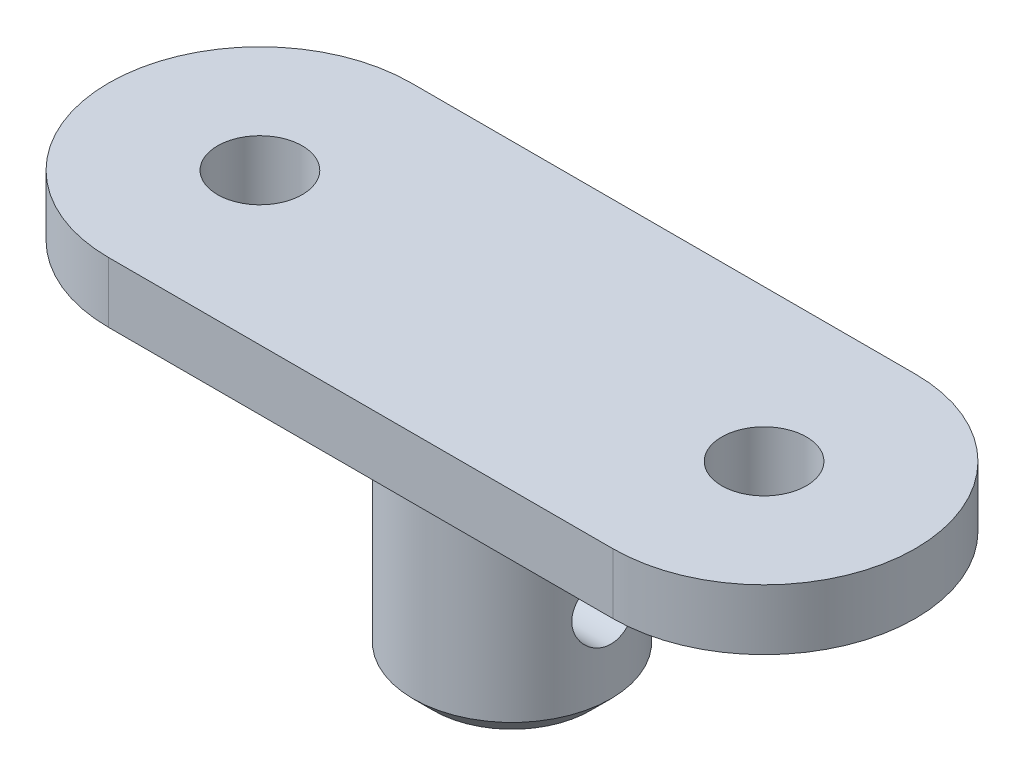
ISO-10303-21;
HEADER;
FILE_DESCRIPTION(('STEP AP214'),'2;1');
FILE_NAME('part.step','',(''),(''),'','','');
FILE_SCHEMA(('AUTOMOTIVE_DESIGN { 1 0 10303 214 1 1 1 1 }'));
ENDSEC;
DATA;
#1=APPLICATION_CONTEXT('core data for automotive mechanical design processes');
#2=APPLICATION_PROTOCOL_DEFINITION('international standard','automotive_design',2000,#1);
#3=PRODUCT_CONTEXT('',#1,'mechanical');
#4=PRODUCT('Part','Part','',(#3));
#5=PRODUCT_RELATED_PRODUCT_CATEGORY('part','',(#4));
#6=PRODUCT_DEFINITION_FORMATION('','',#4);
#7=PRODUCT_DEFINITION_CONTEXT('part definition',#1,'design');
#8=PRODUCT_DEFINITION('design','',#6,#7);
#9=PRODUCT_DEFINITION_SHAPE('','',#8);
#10=(LENGTH_UNIT() NAMED_UNIT(*) SI_UNIT(.MILLI.,.METRE.));
#11=(NAMED_UNIT(*) PLANE_ANGLE_UNIT() SI_UNIT($,.RADIAN.));
#12=(NAMED_UNIT(*) SI_UNIT($,.STERADIAN.) SOLID_ANGLE_UNIT());
#13=UNCERTAINTY_MEASURE_WITH_UNIT(LENGTH_MEASURE(1.E-05),#10,'distance_accuracy_value','');
#14=(GEOMETRIC_REPRESENTATION_CONTEXT(3) GLOBAL_UNCERTAINTY_ASSIGNED_CONTEXT((#13)) GLOBAL_UNIT_ASSIGNED_CONTEXT((#10,
#11,#12)) REPRESENTATION_CONTEXT('',''));
#15=CARTESIAN_POINT('',(0.,0.,0.));
#16=DIRECTION('',(0.,0.,1.));
#17=DIRECTION('',(1.,0.,0.));
#18=AXIS2_PLACEMENT_3D('',#15,#16,#17);
#19=CARTESIAN_POINT('',(0.,15.,0.));
#20=DIRECTION('',(0.,-1.,0.));
#21=DIRECTION('',(0.,0.,-1.));
#22=AXIS2_PLACEMENT_3D('',#19,#20,#21);
#23=CYLINDRICAL_SURFACE('',#22,4.9);
#24=CARTESIAN_POINT('',(4.61383788185064,5.,-1.65));
#25=CARTESIAN_POINT('',(4.61383741638784,4.91018622223396,-1.65000061826013));
#26=CARTESIAN_POINT('',(4.61648902868653,4.82037649379896,-1.64264203896412));
#27=CARTESIAN_POINT('',(4.62675242808979,4.64342146354669,-1.61350405268786));
#28=CARTESIAN_POINT('',(4.63436494825937,4.55627655749849,-1.5917225144436));
#29=CARTESIAN_POINT('',(4.65359224203534,4.38724403113662,-1.53459341170567));
#30=CARTESIAN_POINT('',(4.66519903629909,4.30534631254454,-1.49927287810168));
#31=CARTESIAN_POINT('',(4.69109538211934,4.14861188739389,-1.41616100976829));
#32=CARTESIAN_POINT('',(4.70538554416184,4.07377679346765,-1.36836683622701));
#33=CARTESIAN_POINT('',(4.73567849827398,3.93030312041319,-1.2596197021252));
#34=CARTESIAN_POINT('',(4.75172460314816,3.86198764267123,-1.19825242353303));
#35=CARTESIAN_POINT('',(4.78335572567372,3.73639688446341,-1.06498488639191));
#36=CARTESIAN_POINT('',(4.7989406672018,3.67912341816897,-0.993082900429704));
#37=CARTESIAN_POINT('',(4.82839597766151,3.57576949916901,-0.838417273941764));
#38=CARTESIAN_POINT('',(4.84220948634913,3.53002856624415,-0.755414965953101));
#39=CARTESIAN_POINT('',(4.86605439187122,3.45328657732961,-0.582349019455718));
#40=CARTESIAN_POINT('',(4.87608683011627,3.42228146207618,-0.492287333560855));
#41=CARTESIAN_POINT('',(4.89093236595755,3.37698979687593,-0.311047525716084));
#42=CARTESIAN_POINT('',(4.89591788182399,3.36214953659557,-0.220022162893077));
#43=CARTESIAN_POINT('',(4.90072039525904,3.34784719135327,-0.0366458571353608));
#44=CARTESIAN_POINT('',(4.90053875171023,3.3483810632341,0.0557047309003419));
#45=CARTESIAN_POINT('',(4.89514369864829,3.36446284238568,0.23518692874002));
#46=CARTESIAN_POINT('',(4.89013192574893,3.37940910923578,0.322379504325789));
#47=CARTESIAN_POINT('',(4.87589377741665,3.42289515261397,0.4929375913578));
#48=CARTESIAN_POINT('',(4.86666711487606,3.45143585516639,0.576302841670504));
#49=CARTESIAN_POINT('',(4.84478142949621,3.52164608937421,0.738143239333841));
#50=CARTESIAN_POINT('',(4.83207845069587,3.56348494398242,0.816538740799304));
#51=CARTESIAN_POINT('',(4.80455956847528,3.65896356057803,0.965372506411448));
#52=CARTESIAN_POINT('',(4.78974306954631,3.71260665086469,1.03580851782116));
#53=CARTESIAN_POINT('',(4.75871720972646,3.83319274113201,1.17030053479087));
#54=CARTESIAN_POINT('',(4.74247512826441,3.9006504289464,1.23388819953431));
#55=CARTESIAN_POINT('',(4.71102573247564,4.04540738067902,1.34900194117804));
#56=CARTESIAN_POINT('',(4.69581858478183,4.12270822370127,1.40052607899436));
#57=CARTESIAN_POINT('',(4.66797956974422,4.28646906803758,1.49071671197138));
#58=CARTESIAN_POINT('',(4.65538918352226,4.37304777465974,1.52918145703781));
#59=CARTESIAN_POINT('',(4.63468916349996,4.55198446849131,1.59082564701159));
#60=CARTESIAN_POINT('',(4.62657760576628,4.64433995520701,1.61401165590863));
#61=CARTESIAN_POINT('',(4.61619043349539,4.82766423609059,1.64347807659181));
#62=CARTESIAN_POINT('',(4.61366387213311,4.91850187189872,1.65048609014972));
#63=CARTESIAN_POINT('',(4.61403058304539,5.10007122710816,1.64946164296023));
#64=CARTESIAN_POINT('',(4.6169228448424,5.19080296310024,1.64143198636947));
#65=CARTESIAN_POINT('',(4.62755076033307,5.36624375863268,1.61121444075725));
#66=CARTESIAN_POINT('',(4.63511181049761,5.4510523566326,1.58953642404716));
#67=CARTESIAN_POINT('',(4.65403211154475,5.61580977051476,1.53325162558441));
#68=CARTESIAN_POINT('',(4.66539204439185,5.69575771077812,1.49864252234931));
#69=CARTESIAN_POINT('',(4.69108297608795,5.85137876272631,1.41621195041342));
#70=CARTESIAN_POINT('',(4.70549788236489,5.92683125791374,1.36800084164347));
#71=CARTESIAN_POINT('',(4.73551350346967,6.06883805162643,1.26017419241338));
#72=CARTESIAN_POINT('',(4.75111457388091,6.1353896652546,1.20055522396398));
#73=CARTESIAN_POINT('',(4.78267424054712,6.26109489943231,1.06811854902206));
#74=CARTESIAN_POINT('',(4.79861259143458,6.31972260003638,0.994795338780943));
#75=CARTESIAN_POINT('',(4.82829471251658,6.4238779973428,0.838959214658451));
#76=CARTESIAN_POINT('',(4.84203855584006,6.46940613061077,0.756446607156707));
#77=CARTESIAN_POINT('',(4.86572222886383,6.54565928233716,0.584963460623602));
#78=CARTESIAN_POINT('',(4.87568610398889,6.57647820554063,0.496038176696714));
#79=CARTESIAN_POINT('',(4.89079012161,6.62259320012081,0.313864377355275));
#80=CARTESIAN_POINT('',(4.89593204503164,6.63789500271568,0.220617471439903));
#81=CARTESIAN_POINT('',(4.90067565580974,6.65201728181243,0.0372530306954985));
#82=CARTESIAN_POINT('',(4.90053090751275,6.65159205976993,-0.0528004719434241));
#83=CARTESIAN_POINT('',(4.89534460695464,6.63613923928317,-0.231493223876889));
#84=CARTESIAN_POINT('',(4.89030346576574,6.62111286666524,-0.320132591258916));
#85=CARTESIAN_POINT('',(4.8759857318464,6.57738755965385,-0.492023220498188));
#86=CARTESIAN_POINT('',(4.86678034604106,6.54891815098851,-0.575339225773233));
#87=CARTESIAN_POINT('',(4.84508239028603,6.47932850459625,-0.736042562405831));
#88=CARTESIAN_POINT('',(4.83258922180682,6.43820596317914,-0.813428810956178));
#89=CARTESIAN_POINT('',(4.8050182135104,6.34270748456175,-0.963234092477963));
#90=CARTESIAN_POINT('',(4.7898611509712,6.28789319997856,-1.03535890495902));
#91=CARTESIAN_POINT('',(4.75885682358321,6.16730841181274,-1.16963203566156));
#92=CARTESIAN_POINT('',(4.74300933746596,6.10153437646337,-1.23177712521106));
#93=CARTESIAN_POINT('',(4.71165075173436,5.95773838887022,-1.34686759761613));
#94=CARTESIAN_POINT('',(4.69617875446858,5.8793304959504,-1.3993429927178));
#95=CARTESIAN_POINT('',(4.6681012233117,5.71432552243888,-1.49033873673623));
#96=CARTESIAN_POINT('',(4.65549501397056,5.627730378363,-1.52886237527542));
#97=CARTESIAN_POINT('',(4.63515458734399,5.4521688579169,-1.58944341283123));
#98=CARTESIAN_POINT('',(4.62725189577735,5.36342117668457,-1.61207623528538));
#99=CARTESIAN_POINT('',(4.61659471799071,5.18311356980125,-1.64235148330365));
#100=CARTESIAN_POINT('',(4.61383835633573,5.09155468098428,-1.64999936975584));
#101=CARTESIAN_POINT('',(4.61383788185064,5.,-1.65));
#102=B_SPLINE_CURVE_WITH_KNOTS('',3,(#24,#25,#26,#27,#28,#29,#30,#31,#32,#33,#34,#35,#36,#37,
#38,#39,#40,#41,#42,#43,#44,#45,#46,#47,#48,#49,#50,#51,#52,#53,#54,#55,#56,#57,#58,#59,#60,#61,
#62,#63,#64,#65,#66,#67,#68,#69,#70,#71,#72,#73,#74,#75,#76,#77,#78,#79,#80,#81,#82,#83,#84,#85,
#86,#87,#88,#89,#90,#91,#92,#93,#94,#95,#96,#97,#98,#99,#100,#101),.UNSPECIFIED.,.T.,.F.,(4,2,2,
2,2,2,2,2,2,2,2,2,2,2,2,2,2,2,2,2,2,2,2,2,2,2,2,2,2,2,2,2,2,2,2,2,2,2,4),(0.,0.269102142039234,
0.538244057868016,0.806851401650254,1.07551992979177,1.35393092208069,1.63238761760394,
1.91827591481017,2.2040854128872,2.47976293671465,2.75536796231048,3.01994467186662,
3.28453940640933,3.55264807655731,3.82083243918692,4.10188589537131,4.38298449694958,
4.66824670239064,4.95338627458246,5.22542861262789,5.49742022650095,5.7598090396497,
6.02224498139305,6.29313341544778,6.56410337795041,6.84842140135261,7.13272994826958,
7.41519832999542,7.69756234453574,7.96640197756181,8.23521904235063,8.49960370816546,
8.76403653763409,9.03836411653035,9.31278026873824,9.59822274214104,9.88359786845124,
10.1580161689934,10.4323344459817),.UNSPECIFIED.);
#103=CARTESIAN_POINT('',(4.61383788185064,5.,-1.65));
#104=VERTEX_POINT('',#103);
#105=EDGE_CURVE('E131',#104,#104,#102,.T.);
#106=ORIENTED_EDGE('',*,*,#105,.T.);
#107=EDGE_LOOP('',(#106));
#108=FACE_BOUND('',#107,.T.);
#109=CARTESIAN_POINT('',(-4.9,3.35,0.));
#110=CARTESIAN_POINT('',(-4.90000038791869,3.34999939535854,-0.0899772794896306));
#111=CARTESIAN_POINT('',(-4.89749890439185,3.35738379801928,-0.17995055045503));
#112=CARTESIAN_POINT('',(-4.88776666165979,3.38663367790602,-0.357243830798704));
#113=CARTESIAN_POINT('',(-4.88053550712478,3.4085003656365,-0.44456361774687));
#114=CARTESIAN_POINT('',(-4.8621289144439,3.46587808831725,-0.613968367145328));
#115=CARTESIAN_POINT('',(-4.85096015329265,3.50136603469655,-0.696061915233231));
#116=CARTESIAN_POINT('',(-4.82581616548723,3.5848735219459,-0.853131449248442));
#117=CARTESIAN_POINT('',(-4.81184036774064,3.63289561348786,-0.928105982231245));
#118=CARTESIAN_POINT('',(-4.78199989362341,3.74188566406795,-1.07145261780115));
#119=CARTESIAN_POINT('',(-4.76608930241227,3.8032165557435,-1.1395391574267));
#120=CARTESIAN_POINT('',(-4.73442291223427,3.93631173729451,-1.26467956457131));
#121=CARTESIAN_POINT('',(-4.71866714906096,4.00807838184709,-1.32173093537596));
#122=CARTESIAN_POINT('',(-4.68858693839304,4.16259561668466,-1.42482571433906));
#123=CARTESIAN_POINT('',(-4.67431831154573,4.24560745048325,-1.4704954365696));
#124=CARTESIAN_POINT('',(-4.64952731093173,4.41869153852099,-1.547103412454));
#125=CARTESIAN_POINT('',(-4.63900376736657,4.50876157734386,-1.57804626715083));
#126=CARTESIAN_POINT('',(-4.623378492492,4.69015443693696,-1.62324646549038));
#127=CARTESIAN_POINT('',(-4.61810316811064,4.78132831168579,-1.63803973603628));
#128=CARTESIAN_POINT('',(-4.61305855746477,4.96500495653313,-1.65219630303995));
#129=CARTESIAN_POINT('',(-4.61328752819399,5.05750729668302,-1.65156448405094));
#130=CARTESIAN_POINT('',(-4.61907369878178,5.2366198865509,-1.63530441900032));
#131=CARTESIAN_POINT('',(-4.62438124702715,5.32330339273847,-1.62037879571232));
#132=CARTESIAN_POINT('',(-4.63931754092689,5.49285542548364,-1.57710221034144));
#133=CARTESIAN_POINT('',(-4.64894681389905,5.57572348513642,-1.54874960993472));
#134=CARTESIAN_POINT('',(-4.67161725774667,5.73687569975341,-1.47896990910225));
#135=CARTESIAN_POINT('',(-4.68471162193192,5.8150627956466,-1.43733668695831));
#136=CARTESIAN_POINT('',(-4.71281491298858,5.96356166721388,-1.34232067014667));
#137=CARTESIAN_POINT('',(-4.72782440137364,6.03387112176583,-1.28893442615412));
#138=CARTESIAN_POINT('',(-4.75904561062351,6.16856271915874,-1.16856571945658));
#139=CARTESIAN_POINT('',(-4.77527875045023,6.23242853038513,-1.10100985162213));
#140=CARTESIAN_POINT('',(-4.80641866433893,6.34806083210047,-0.955947768304286));
#141=CARTESIAN_POINT('',(-4.82132530582401,6.39982611404113,-0.878440560120904));
#142=CARTESIAN_POINT('',(-4.84833537767025,6.49021507020997,-0.714563768137236));
#143=CARTESIAN_POINT('',(-4.86040833654256,6.52869781658655,-0.628111084971806));
#144=CARTESIAN_POINT('',(-4.88016922966956,6.5904128444674,-0.449455010213595));
#145=CARTESIAN_POINT('',(-4.88785871964477,6.61365053697882,-0.357253671758919));
#146=CARTESIAN_POINT('',(-4.89772732847351,6.6432950850064,-0.174086694882146));
#147=CARTESIAN_POINT('',(-4.90013464977819,6.65039944540453,-0.0832460898984121));
#148=CARTESIAN_POINT('',(-4.89985371268991,6.64956599441785,0.0983489727626959));
#149=CARTESIAN_POINT('',(-4.89716633441869,6.64163078115599,0.189103442610372));
#150=CARTESIAN_POINT('',(-4.88714863077872,6.61149384646353,0.365141192906475));
#151=CARTESIAN_POINT('',(-4.87995845296456,6.58972247630194,0.450506912031592));
#152=CARTESIAN_POINT('',(-4.86179920053171,6.53307149349237,0.61633788596585));
#153=CARTESIAN_POINT('',(-4.85082964222992,6.49819020299187,0.69680251198387));
#154=CARTESIAN_POINT('',(-4.82585999533039,6.41528250373735,0.852933671835092));
#155=CARTESIAN_POINT('',(-4.81178706398892,6.36693115116013,0.928415671586986));
#156=CARTESIAN_POINT('',(-4.78220350422765,6.25883635953589,1.07042023533106));
#157=CARTESIAN_POINT('',(-4.76669242957539,6.19908937849072,1.1369400026767));
#158=CARTESIAN_POINT('',(-4.73506701224516,6.06662029760269,1.26234667704003));
#159=CARTESIAN_POINT('',(-4.71895808841253,5.99342464513948,1.32073594481882));
#160=CARTESIAN_POINT('',(-4.68869090323433,5.83792992169544,1.42446722625939));
#161=CARTESIAN_POINT('',(-4.67453266768737,5.75563073034279,1.46980906737263));
#162=CARTESIAN_POINT('',(-4.64990386642468,5.58418893816769,1.54596335328321));
#163=CARTESIAN_POINT('',(-4.6394272277316,5.49505790554068,1.57679975425569));
#164=CARTESIAN_POINT('',(-4.62351186297584,5.31243241474187,1.6228813846772));
#165=CARTESIAN_POINT('',(-4.61807080555317,5.21893999687347,1.63813382948524));
#166=CARTESIAN_POINT('',(-4.61311139144736,5.03551710459682,1.65204484473692));
#167=CARTESIAN_POINT('',(-4.61329761428516,4.94565670467364,1.6515310848963));
#168=CARTESIAN_POINT('',(-4.61883925530788,4.7673743443067,1.63596778526243));
#169=CARTESIAN_POINT('',(-4.62419435366452,4.67895229520806,1.62091914482643));
#170=CARTESIAN_POINT('',(-4.63924822601539,4.50780065550128,1.57730413644212));
#171=CARTESIAN_POINT('',(-4.64885895854189,4.42499304937698,1.54901112485278));
#172=CARTESIAN_POINT('',(-4.67130711942719,4.26523761176915,1.47993329208238));
#173=CARTESIAN_POINT('',(-4.68414527303989,4.18829110244001,1.43914566270712));
#174=CARTESIAN_POINT('',(-4.71231180165105,4.03874066798729,1.34412551404985));
#175=CARTESIAN_POINT('',(-4.72772539348958,3.96648090892291,1.28937674238835));
#176=CARTESIAN_POINT('',(-4.75895448842747,3.83190713912614,1.16885530831289));
#177=CARTESIAN_POINT('',(-4.77477010514934,3.769595977179,1.10307949931577));
#178=CARTESIAN_POINT('',(-4.80578232220498,3.65416838885613,0.959206319984847));
#179=CARTESIAN_POINT('',(-4.82092870193237,3.60152061552783,0.880720748755576));
#180=CARTESIAN_POINT('',(-4.84819957124039,3.51022012361671,0.71551182973093));
#181=CARTESIAN_POINT('',(-4.86032476022777,3.47156416498398,0.628790394973419));
#182=CARTESIAN_POINT('',(-4.87979151905399,3.41076584121907,0.452942851391897));
#183=CARTESIAN_POINT('',(-4.88729703860754,3.38805290017338,0.364032603619442));
#184=CARTESIAN_POINT('',(-4.89740036865913,3.35767247272829,0.18341296866928));
#185=CARTESIAN_POINT('',(-4.89999960463517,3.35000061624762,0.0917044023900257));
#186=CARTESIAN_POINT('',(-4.9,3.35,0.));
#187=B_SPLINE_CURVE_WITH_KNOTS('',3,(#109,#110,#111,#112,#113,#114,#115,#116,#117,#118,#119,
#120,#121,#122,#123,#124,#125,#126,#127,#128,#129,#130,#131,#132,#133,#134,#135,#136,#137,#138,
#139,#140,#141,#142,#143,#144,#145,#146,#147,#148,#149,#150,#151,#152,#153,#154,#155,#156,#157,
#158,#159,#160,#161,#162,#163,#164,#165,#166,#167,#168,#169,#170,#171,#172,#173,#174,#175,#176,
#177,#178,#179,#180,#181,#182,#183,#184,#185,#186),.UNSPECIFIED.,.T.,.F.,(4,2,2,2,2,2,2,2,2,2,2,
2,2,2,2,2,2,2,2,2,2,2,2,2,2,2,2,2,2,2,2,2,2,2,2,2,2,2,4),(0.,0.269594308183774,
0.539211153302104,0.808372991177137,1.07758964567766,1.35536237997832,1.63319788722412,
1.91921604910046,2.20514479297097,2.48126583078711,2.7572994324558,3.02042554939657,
3.28358378055793,3.55104319584596,3.81858121110666,4.10039224367892,4.38223141029847,
4.66697505791312,4.95161758520978,5.223698559487,5.49573253539769,5.75969381362833,
6.02368888603787,6.2947053921791,6.56580627356451,6.84949134328303,7.13318016448437,
7.41639880562234,7.69948625725712,7.96773935532174,8.23597585607664,8.49890496721256,
8.76189321568341,9.03655028201679,9.31128585601235,9.59703343195235,9.88271479563613,
10.1575638608962,10.4323330588535),.UNSPECIFIED.);
#188=CARTESIAN_POINT('',(-4.9,3.35,0.));
#189=VERTEX_POINT('',#188);
#190=EDGE_CURVE('E143',#189,#189,#187,.T.);
#191=ORIENTED_EDGE('',*,*,#190,.T.);
#192=EDGE_LOOP('',(#191));
#193=FACE_BOUND('',#192,.T.);
#194=CARTESIAN_POINT('',(0.,0.999999999999999,0.));
#195=DIRECTION('',(0.,1.,0.));
#196=DIRECTION('',(0.,0.,1.));
#197=AXIS2_PLACEMENT_3D('',#194,#195,#196);
#198=CIRCLE('',#197,4.9);
#199=CARTESIAN_POINT('',(0.,0.999999999999999,4.9));
#200=VERTEX_POINT('',#199);
#201=EDGE_CURVE('E174',#200,#200,#198,.T.);
#202=ORIENTED_EDGE('',*,*,#201,.T.);
#203=EDGE_LOOP('',(#202));
#204=FACE_BOUND('',#203,.T.);
#205=CARTESIAN_POINT('',(0.,12.,0.));
#206=DIRECTION('',(0.,1.,0.));
#207=DIRECTION('',(0.,0.,1.));
#208=AXIS2_PLACEMENT_3D('',#205,#206,#207);
#209=CIRCLE('',#208,4.9);
#210=CARTESIAN_POINT('',(0.,12.,4.9));
#211=VERTEX_POINT('',#210);
#212=EDGE_CURVE('E11',#211,#211,#209,.T.);
#213=ORIENTED_EDGE('',*,*,#212,.F.);
#214=EDGE_LOOP('',(#213));
#215=FACE_BOUND('',#214,.T.);
#216=ADVANCED_FACE('F41',(#108,#193,#204,#215),#23,.T.);
#217=CARTESIAN_POINT('',(0.,0.,0.));
#218=DIRECTION('',(0.,1.,0.));
#219=DIRECTION('',(0.,0.,1.));
#220=AXIS2_PLACEMENT_3D('',#217,#218,#219);
#221=PLANE('',#220);
#222=CARTESIAN_POINT('',(0.,0.,0.));
#223=DIRECTION('',(0.,1.,0.));
#224=DIRECTION('',(0.,0.,1.));
#225=AXIS2_PLACEMENT_3D('',#222,#223,#224);
#226=CIRCLE('',#225,3.9);
#227=CARTESIAN_POINT('',(0.,0.,3.9));
#228=VERTEX_POINT('',#227);
#229=EDGE_CURVE('E51',#228,#228,#226,.F.);
#230=ORIENTED_EDGE('',*,*,#229,.T.);
#231=EDGE_LOOP('',(#230));
#232=FACE_BOUND('',#231,.T.);
#233=ADVANCED_FACE('F155',(#232),#221,.F.);
#234=CARTESIAN_POINT('',(4.9,5.,0.));
#235=DIRECTION('',(1.,0.,0.));
#236=DIRECTION('',(0.,0.,-1.));
#237=AXIS2_PLACEMENT_3D('',#234,#235,#236);
#238=CYLINDRICAL_SURFACE('',#237,1.65);
#239=ORIENTED_EDGE('',*,*,#105,.F.);
#240=EDGE_LOOP('',(#239));
#241=FACE_BOUND('',#240,.T.);
#242=ORIENTED_EDGE('',*,*,#190,.F.);
#243=EDGE_LOOP('',(#242));
#244=FACE_BOUND('',#243,.T.);
#245=ADVANCED_FACE('F150',(#241,#244),#238,.F.);
#246=CARTESIAN_POINT('',(0.,0.999999999999999,0.));
#247=DIRECTION('',(0.,1.,0.));
#248=DIRECTION('',(0.,0.,1.));
#249=AXIS2_PLACEMENT_3D('',#246,#247,#248);
#250=CONICAL_SURFACE('',#249,4.9,0.78539816339745);
#251=ORIENTED_EDGE('',*,*,#229,.F.);
#252=EDGE_LOOP('',(#251));
#253=FACE_BOUND('',#252,.T.);
#254=ORIENTED_EDGE('',*,*,#201,.F.);
#255=EDGE_LOOP('',(#254));
#256=FACE_BOUND('',#255,.T.);
#257=ADVANCED_FACE('F43',(#253,#256),#250,.T.);
#258=CARTESIAN_POINT('',(-12.5,12.,0.));
#259=DIRECTION('',(0.,1.,0.));
#260=DIRECTION('',(0.,0.,1.));
#261=AXIS2_PLACEMENT_3D('',#258,#259,#260);
#262=CYLINDRICAL_SURFACE('',#261,7.5);
#263=CARTESIAN_POINT('',(-12.5,15.,0.));
#264=DIRECTION('',(0.,1.,0.));
#265=DIRECTION('',(0.,0.,1.));
#266=AXIS2_PLACEMENT_3D('',#263,#264,#265);
#267=CIRCLE('',#266,7.5);
#268=CARTESIAN_POINT('',(-12.5,15.,-7.5));
#269=VERTEX_POINT('',#268);
#270=CARTESIAN_POINT('',(-12.5,15.,7.5));
#271=VERTEX_POINT('',#270);
#272=EDGE_CURVE('E116',#269,#271,#267,.T.);
#273=ORIENTED_EDGE('',*,*,#272,.F.);
#274=DIRECTION('',(0.,1.,0.));
#275=VECTOR('',#274,1.);
#276=CARTESIAN_POINT('',(-12.5,12.,-7.5));
#277=LINE('',#276,#275);
#278=CARTESIAN_POINT('',(-12.5,12.,-7.5));
#279=VERTEX_POINT('',#278);
#280=EDGE_CURVE('E59',#279,#269,#277,.T.);
#281=ORIENTED_EDGE('',*,*,#280,.F.);
#282=CARTESIAN_POINT('',(-12.5,12.,0.));
#283=DIRECTION('',(0.,1.,0.));
#284=DIRECTION('',(0.,0.,1.));
#285=AXIS2_PLACEMENT_3D('',#282,#283,#284);
#286=CIRCLE('',#285,7.5);
#287=CARTESIAN_POINT('',(-12.5,12.,7.5));
#288=VERTEX_POINT('',#287);
#289=EDGE_CURVE('E107',#279,#288,#286,.T.);
#290=ORIENTED_EDGE('',*,*,#289,.T.);
#291=DIRECTION('',(0.,1.,0.));
#292=VECTOR('',#291,1.);
#293=CARTESIAN_POINT('',(-12.5,12.,7.5));
#294=LINE('',#293,#292);
#295=EDGE_CURVE('E87',#288,#271,#294,.T.);
#296=ORIENTED_EDGE('',*,*,#295,.T.);
#297=EDGE_LOOP('',(#273,#281,#290,#296));
#298=FACE_BOUND('',#297,.T.);
#299=ADVANCED_FACE('F157',(#298),#262,.T.);
#300=CARTESIAN_POINT('',(-12.5,12.,-7.5));
#301=DIRECTION('',(0.,0.,-1.));
#302=DIRECTION('',(-1.,0.,0.));
#303=AXIS2_PLACEMENT_3D('',#300,#301,#302);
#304=PLANE('',#303);
#305=DIRECTION('',(-1.,0.,0.));
#306=VECTOR('',#305,1.);
#307=CARTESIAN_POINT('',(-12.5,15.,-7.5));
#308=LINE('',#307,#306);
#309=CARTESIAN_POINT('',(12.5,15.,-7.5));
#310=VERTEX_POINT('',#309);
#311=EDGE_CURVE('E110',#310,#269,#308,.T.);
#312=ORIENTED_EDGE('',*,*,#311,.F.);
#313=DIRECTION('',(0.,1.,0.));
#314=VECTOR('',#313,1.);
#315=CARTESIAN_POINT('',(12.5,12.,-7.5));
#316=LINE('',#315,#314);
#317=CARTESIAN_POINT('',(12.5,12.,-7.5));
#318=VERTEX_POINT('',#317);
#319=EDGE_CURVE('E76',#318,#310,#316,.T.);
#320=ORIENTED_EDGE('',*,*,#319,.F.);
#321=DIRECTION('',(-1.,0.,0.));
#322=VECTOR('',#321,1.);
#323=CARTESIAN_POINT('',(-12.5,12.,-7.5));
#324=LINE('',#323,#322);
#325=EDGE_CURVE('E102',#318,#279,#324,.T.);
#326=ORIENTED_EDGE('',*,*,#325,.T.);
#327=ORIENTED_EDGE('',*,*,#280,.T.);
#328=EDGE_LOOP('',(#312,#320,#326,#327));
#329=FACE_BOUND('',#328,.T.);
#330=ADVANCED_FACE('F214',(#329),#304,.T.);
#331=CARTESIAN_POINT('',(12.5,12.,0.));
#332=DIRECTION('',(0.,1.,0.));
#333=DIRECTION('',(0.,0.,1.));
#334=AXIS2_PLACEMENT_3D('',#331,#332,#333);
#335=CYLINDRICAL_SURFACE('',#334,7.5);
#336=CARTESIAN_POINT('',(12.5,15.,0.));
#337=DIRECTION('',(0.,1.,0.));
#338=DIRECTION('',(0.,0.,1.));
#339=AXIS2_PLACEMENT_3D('',#336,#337,#338);
#340=CIRCLE('',#339,7.5);
#341=CARTESIAN_POINT('',(12.5,15.,7.5));
#342=VERTEX_POINT('',#341);
#343=EDGE_CURVE('E95',#342,#310,#340,.T.);
#344=ORIENTED_EDGE('',*,*,#343,.F.);
#345=DIRECTION('',(0.,1.,0.));
#346=VECTOR('',#345,1.);
#347=CARTESIAN_POINT('',(12.5,12.,7.5));
#348=LINE('',#347,#346);
#349=CARTESIAN_POINT('',(12.5,12.,7.5));
#350=VERTEX_POINT('',#349);
#351=EDGE_CURVE('E90',#350,#342,#348,.T.);
#352=ORIENTED_EDGE('',*,*,#351,.F.);
#353=CARTESIAN_POINT('',(12.5,12.,0.));
#354=DIRECTION('',(0.,1.,0.));
#355=DIRECTION('',(0.,0.,1.));
#356=AXIS2_PLACEMENT_3D('',#353,#354,#355);
#357=CIRCLE('',#356,7.5);
#358=EDGE_CURVE('E93',#350,#318,#357,.T.);
#359=ORIENTED_EDGE('',*,*,#358,.T.);
#360=ORIENTED_EDGE('',*,*,#319,.T.);
#361=EDGE_LOOP('',(#344,#352,#359,#360));
#362=FACE_BOUND('',#361,.T.);
#363=ADVANCED_FACE('F92',(#362),#335,.T.);
#364=CARTESIAN_POINT('',(-12.5,12.,7.5));
#365=DIRECTION('',(0.,0.,1.));
#366=DIRECTION('',(1.,0.,0.));
#367=AXIS2_PLACEMENT_3D('',#364,#365,#366);
#368=PLANE('',#367);
#369=DIRECTION('',(1.,0.,0.));
#370=VECTOR('',#369,1.);
#371=CARTESIAN_POINT('',(-12.5,15.,7.5));
#372=LINE('',#371,#370);
#373=EDGE_CURVE('E120',#271,#342,#372,.T.);
#374=ORIENTED_EDGE('',*,*,#373,.F.);
#375=ORIENTED_EDGE('',*,*,#295,.F.);
#376=DIRECTION('',(1.,0.,0.));
#377=VECTOR('',#376,1.);
#378=CARTESIAN_POINT('',(-12.5,12.,7.5));
#379=LINE('',#378,#377);
#380=EDGE_CURVE('E101',#288,#350,#379,.T.);
#381=ORIENTED_EDGE('',*,*,#380,.T.);
#382=ORIENTED_EDGE('',*,*,#351,.T.);
#383=EDGE_LOOP('',(#374,#375,#381,#382));
#384=FACE_BOUND('',#383,.T.);
#385=ADVANCED_FACE('F105',(#384),#368,.T.);
#386=CARTESIAN_POINT('',(-12.5,12.,0.));
#387=DIRECTION('',(0.,1.,0.));
#388=DIRECTION('',(0.,0.,1.));
#389=AXIS2_PLACEMENT_3D('',#386,#387,#388);
#390=PLANE('',#389);
#391=ORIENTED_EDGE('',*,*,#212,.T.);
#392=EDGE_LOOP('',(#391));
#393=FACE_BOUND('',#392,.T.);
#394=CARTESIAN_POINT('',(12.5,12.,0.));
#395=DIRECTION('',(0.,1.,0.));
#396=DIRECTION('',(0.,0.,1.));
#397=AXIS2_PLACEMENT_3D('',#394,#395,#396);
#398=CIRCLE('',#397,2.1);
#399=CARTESIAN_POINT('',(12.5,12.,2.09999999999999));
#400=VERTEX_POINT('',#399);
#401=EDGE_CURVE('E194',#400,#400,#398,.T.);
#402=ORIENTED_EDGE('',*,*,#401,.T.);
#403=EDGE_LOOP('',(#402));
#404=FACE_BOUND('',#403,.T.);
#405=CARTESIAN_POINT('',(-12.5,12.,0.));
#406=DIRECTION('',(0.,1.,0.));
#407=DIRECTION('',(0.,0.,1.));
#408=AXIS2_PLACEMENT_3D('',#405,#406,#407);
#409=CIRCLE('',#408,2.1);
#410=CARTESIAN_POINT('',(-12.5,12.,2.1));
#411=VERTEX_POINT('',#410);
#412=EDGE_CURVE('E121',#411,#411,#409,.T.);
#413=ORIENTED_EDGE('',*,*,#412,.T.);
#414=EDGE_LOOP('',(#413));
#415=FACE_BOUND('',#414,.T.);
#416=ORIENTED_EDGE('',*,*,#289,.F.);
#417=ORIENTED_EDGE('',*,*,#325,.F.);
#418=ORIENTED_EDGE('',*,*,#358,.F.);
#419=ORIENTED_EDGE('',*,*,#380,.F.);
#420=EDGE_LOOP('',(#416,#417,#418,#419));
#421=FACE_BOUND('',#420,.T.);
#422=ADVANCED_FACE('F100',(#393,#404,#415,#421),#390,.F.);
#423=CARTESIAN_POINT('',(-12.5,12.,0.));
#424=DIRECTION('',(0.,1.,0.));
#425=DIRECTION('',(0.,0.,1.));
#426=AXIS2_PLACEMENT_3D('',#423,#424,#425);
#427=CYLINDRICAL_SURFACE('',#426,2.1);
#428=ORIENTED_EDGE('',*,*,#412,.F.);
#429=EDGE_LOOP('',(#428));
#430=FACE_BOUND('',#429,.T.);
#431=CARTESIAN_POINT('',(-12.5,15.,0.));
#432=DIRECTION('',(0.,1.,0.));
#433=DIRECTION('',(0.,0.,1.));
#434=AXIS2_PLACEMENT_3D('',#431,#432,#433);
#435=CIRCLE('',#434,2.1);
#436=CARTESIAN_POINT('',(-12.5,15.,2.1));
#437=VERTEX_POINT('',#436);
#438=EDGE_CURVE('E199',#437,#437,#435,.T.);
#439=ORIENTED_EDGE('',*,*,#438,.T.);
#440=EDGE_LOOP('',(#439));
#441=FACE_BOUND('',#440,.T.);
#442=ADVANCED_FACE('F189',(#430,#441),#427,.F.);
#443=CARTESIAN_POINT('',(12.5,12.,0.));
#444=DIRECTION('',(0.,1.,0.));
#445=DIRECTION('',(0.,0.,1.));
#446=AXIS2_PLACEMENT_3D('',#443,#444,#445);
#447=CYLINDRICAL_SURFACE('',#446,2.1);
#448=ORIENTED_EDGE('',*,*,#401,.F.);
#449=EDGE_LOOP('',(#448));
#450=FACE_BOUND('',#449,.T.);
#451=CARTESIAN_POINT('',(12.5,15.,0.));
#452=DIRECTION('',(0.,1.,0.));
#453=DIRECTION('',(0.,0.,1.));
#454=AXIS2_PLACEMENT_3D('',#451,#452,#453);
#455=CIRCLE('',#454,2.1);
#456=CARTESIAN_POINT('',(12.5,15.,2.09999999999999));
#457=VERTEX_POINT('',#456);
#458=EDGE_CURVE('E204',#457,#457,#455,.T.);
#459=ORIENTED_EDGE('',*,*,#458,.T.);
#460=EDGE_LOOP('',(#459));
#461=FACE_BOUND('',#460,.T.);
#462=ADVANCED_FACE('F162',(#450,#461),#447,.F.);
#463=CARTESIAN_POINT('',(0.,15.,0.));
#464=DIRECTION('',(0.,1.,0.));
#465=DIRECTION('',(0.,0.,1.));
#466=AXIS2_PLACEMENT_3D('',#463,#464,#465);
#467=PLANE('',#466);
#468=ORIENTED_EDGE('',*,*,#458,.F.);
#469=EDGE_LOOP('',(#468));
#470=FACE_BOUND('',#469,.T.);
#471=ORIENTED_EDGE('',*,*,#438,.F.);
#472=EDGE_LOOP('',(#471));
#473=FACE_BOUND('',#472,.T.);
#474=ORIENTED_EDGE('',*,*,#272,.T.);
#475=ORIENTED_EDGE('',*,*,#373,.T.);
#476=ORIENTED_EDGE('',*,*,#343,.T.);
#477=ORIENTED_EDGE('',*,*,#311,.T.);
#478=EDGE_LOOP('',(#474,#475,#476,#477));
#479=FACE_BOUND('',#478,.T.);
#480=ADVANCED_FACE('F159',(#470,#473,#479),#467,.T.);
#481=CLOSED_SHELL('',(#216,#233,#245,#257,#299,#330,#363,#385,#422,#442,#462,#480));
#482=MANIFOLD_SOLID_BREP('B2',#481);
#483=ADVANCED_BREP_SHAPE_REPRESENTATION('',(#18,#482),#14);
#484=SHAPE_DEFINITION_REPRESENTATION(#9,#483);
ENDSEC;
END-ISO-10303-21;
